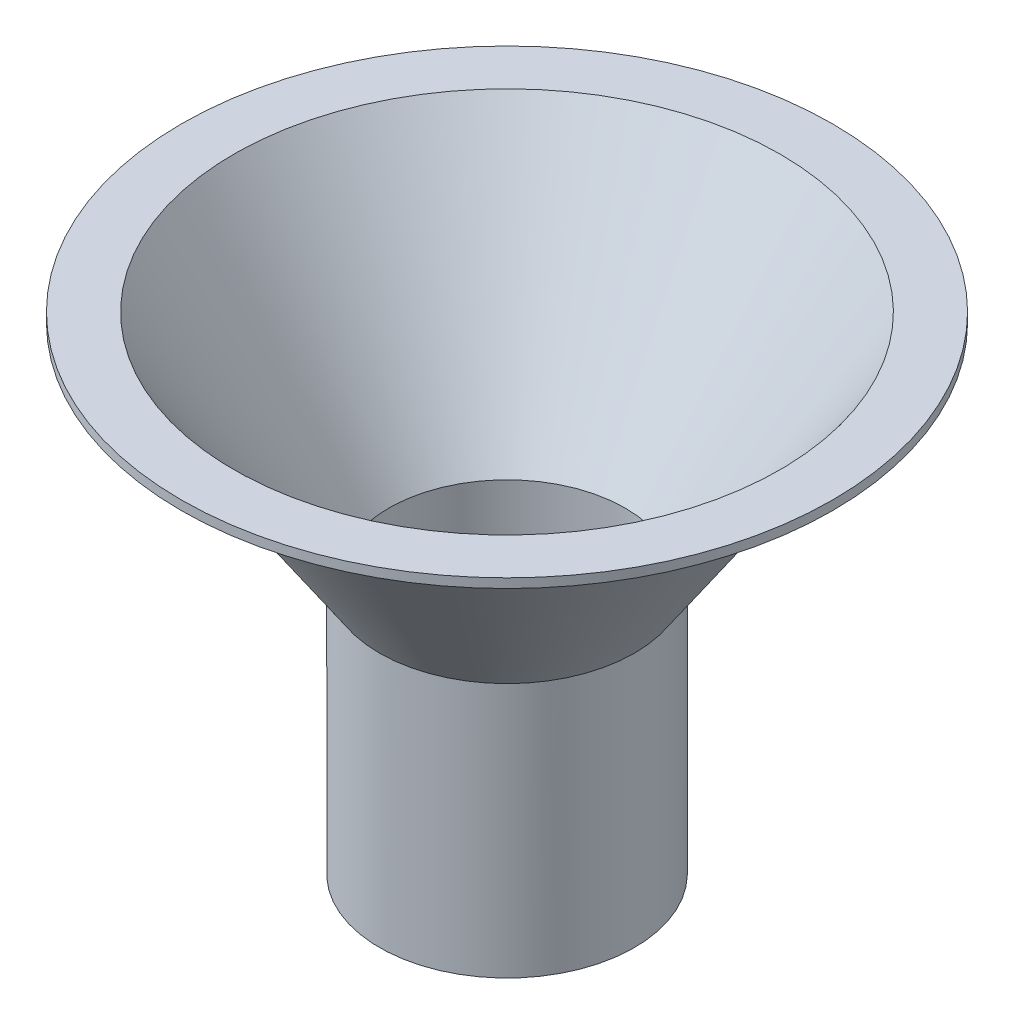
ISO-10303-21;
HEADER;
FILE_DESCRIPTION(('STEP AP214'),'2;1');
FILE_NAME('part.step','',(''),(''),'','','');
FILE_SCHEMA(('AUTOMOTIVE_DESIGN { 1 0 10303 214 1 1 1 1 }'));
ENDSEC;
DATA;
#1=APPLICATION_CONTEXT('core data for automotive mechanical design processes');
#2=APPLICATION_PROTOCOL_DEFINITION('international standard','automotive_design',2000,#1);
#3=PRODUCT_CONTEXT('',#1,'mechanical');
#4=PRODUCT('Part','Part','',(#3));
#5=PRODUCT_RELATED_PRODUCT_CATEGORY('part','',(#4));
#6=PRODUCT_DEFINITION_FORMATION('','',#4);
#7=PRODUCT_DEFINITION_CONTEXT('part definition',#1,'design');
#8=PRODUCT_DEFINITION('design','',#6,#7);
#9=PRODUCT_DEFINITION_SHAPE('','',#8);
#10=(LENGTH_UNIT() NAMED_UNIT(*) SI_UNIT(.MILLI.,.METRE.));
#11=(NAMED_UNIT(*) PLANE_ANGLE_UNIT() SI_UNIT($,.RADIAN.));
#12=(NAMED_UNIT(*) SI_UNIT($,.STERADIAN.) SOLID_ANGLE_UNIT());
#13=UNCERTAINTY_MEASURE_WITH_UNIT(LENGTH_MEASURE(1.E-05),#10,'distance_accuracy_value','');
#14=(GEOMETRIC_REPRESENTATION_CONTEXT(3) GLOBAL_UNCERTAINTY_ASSIGNED_CONTEXT((#13)) GLOBAL_UNIT_ASSIGNED_CONTEXT((#10,
#11,#12)) REPRESENTATION_CONTEXT('',''));
#15=CARTESIAN_POINT('',(0.,0.,0.));
#16=DIRECTION('',(0.,0.,1.));
#17=DIRECTION('',(1.,0.,0.));
#18=AXIS2_PLACEMENT_3D('',#15,#16,#17);
#19=CARTESIAN_POINT('',(-29.,-2.,0.));
#20=DIRECTION('',(0.,-1.,0.));
#21=DIRECTION('',(0.,0.,-1.));
#22=AXIS2_PLACEMENT_3D('',#19,#20,#21);
#23=PLANE('',#22);
#24=CARTESIAN_POINT('',(0.,-2.,0.));
#25=DIRECTION('',(0.,-1.,0.));
#26=DIRECTION('',(0.,0.,-1.));
#27=AXIS2_PLACEMENT_3D('',#24,#25,#26);
#28=CIRCLE('',#27,23.5755389433413);
#29=CARTESIAN_POINT('',(0.,-2.,-23.5755389433413));
#30=VERTEX_POINT('',#29);
#31=EDGE_CURVE('E47',#30,#30,#28,.T.);
#32=ORIENTED_EDGE('',*,*,#31,.T.);
#33=EDGE_LOOP('',(#32));
#34=FACE_BOUND('',#33,.T.);
#35=CARTESIAN_POINT('',(0.,-2.,0.));
#36=DIRECTION('',(0.,1.,0.));
#37=DIRECTION('',(0.,0.,1.));
#38=AXIS2_PLACEMENT_3D('',#35,#36,#37);
#39=CIRCLE('',#38,28.1);
#40=CARTESIAN_POINT('',(0.,-2.,28.1));
#41=VERTEX_POINT('',#40);
#42=EDGE_CURVE('E58',#41,#41,#39,.T.);
#43=ORIENTED_EDGE('',*,*,#42,.T.);
#44=EDGE_LOOP('',(#43));
#45=FACE_BOUND('',#44,.T.);
#46=ADVANCED_FACE('F32',(#34,#45),#23,.F.);
#47=CARTESIAN_POINT('',(-29.,-2.8,0.));
#48=DIRECTION('',(0.,1.,0.));
#49=DIRECTION('',(0.,0.,1.));
#50=AXIS2_PLACEMENT_3D('',#47,#48,#49);
#51=PLANE('',#50);
#52=CARTESIAN_POINT('',(0.,-2.8,0.));
#53=DIRECTION('',(0.,1.,0.));
#54=DIRECTION('',(0.,0.,1.));
#55=AXIS2_PLACEMENT_3D('',#52,#53,#54);
#56=CIRCLE('',#55,28.);
#57=CARTESIAN_POINT('',(0.,-2.8,28.));
#58=VERTEX_POINT('',#57);
#59=EDGE_CURVE('E61',#58,#58,#56,.T.);
#60=ORIENTED_EDGE('',*,*,#59,.T.);
#61=EDGE_LOOP('',(#60));
#62=FACE_BOUND('',#61,.T.);
#63=CARTESIAN_POINT('',(0.,-2.8,0.));
#64=DIRECTION('',(0.,1.,0.));
#65=DIRECTION('',(0.,0.,1.));
#66=AXIS2_PLACEMENT_3D('',#63,#64,#65);
#67=CIRCLE('',#66,28.1);
#68=CARTESIAN_POINT('',(0.,-2.8,28.1));
#69=VERTEX_POINT('',#68);
#70=EDGE_CURVE('E55',#69,#69,#67,.T.);
#71=ORIENTED_EDGE('',*,*,#70,.F.);
#72=EDGE_LOOP('',(#71));
#73=FACE_BOUND('',#72,.T.);
#74=ADVANCED_FACE('F90',(#62,#73),#51,.F.);
#75=CARTESIAN_POINT('',(0.,0.,0.));
#76=DIRECTION('',(0.,-1.,0.));
#77=DIRECTION('',(0.,0.,-1.));
#78=AXIS2_PLACEMENT_3D('',#75,#76,#77);
#79=CYLINDRICAL_SURFACE('',#78,11.);
#80=CARTESIAN_POINT('',(0.,-44.,0.));
#81=DIRECTION('',(0.,-1.,0.));
#82=DIRECTION('',(0.,0.,-1.));
#83=AXIS2_PLACEMENT_3D('',#80,#81,#82);
#84=CIRCLE('',#83,11.);
#85=CARTESIAN_POINT('',(0.,-44.,-11.));
#86=VERTEX_POINT('',#85);
#87=EDGE_CURVE('E10',#86,#86,#84,.T.);
#88=ORIENTED_EDGE('',*,*,#87,.F.);
#89=EDGE_LOOP('',(#88));
#90=FACE_BOUND('',#89,.T.);
#91=CARTESIAN_POINT('',(0.,-22.,0.));
#92=DIRECTION('',(0.,-1.,0.));
#93=DIRECTION('',(0.,0.,-1.));
#94=AXIS2_PLACEMENT_3D('',#91,#92,#93);
#95=CIRCLE('',#94,11.);
#96=CARTESIAN_POINT('',(0.,-22.,-11.));
#97=VERTEX_POINT('',#96);
#98=EDGE_CURVE('E52',#97,#97,#95,.T.);
#99=ORIENTED_EDGE('',*,*,#98,.T.);
#100=EDGE_LOOP('',(#99));
#101=FACE_BOUND('',#100,.T.);
#102=ADVANCED_FACE('F34',(#90,#101),#79,.T.);
#103=CARTESIAN_POINT('',(-11.,-44.,0.));
#104=DIRECTION('',(0.,1.,0.));
#105=DIRECTION('',(0.,0.,1.));
#106=AXIS2_PLACEMENT_3D('',#103,#104,#105);
#107=PLANE('',#106);
#108=CARTESIAN_POINT('',(0.,-44.,0.));
#109=DIRECTION('',(0.,-1.,0.));
#110=DIRECTION('',(0.,0.,-1.));
#111=AXIS2_PLACEMENT_3D('',#108,#109,#110);
#112=CIRCLE('',#111,10.2);
#113=CARTESIAN_POINT('',(0.,-44.,-10.2));
#114=VERTEX_POINT('',#113);
#115=EDGE_CURVE('E39',#114,#114,#112,.T.);
#116=ORIENTED_EDGE('',*,*,#115,.F.);
#117=EDGE_LOOP('',(#116));
#118=FACE_BOUND('',#117,.T.);
#119=ORIENTED_EDGE('',*,*,#87,.T.);
#120=EDGE_LOOP('',(#119));
#121=FACE_BOUND('',#120,.T.);
#122=ADVANCED_FACE('F100',(#118,#121),#107,.F.);
#123=CARTESIAN_POINT('',(0.,0.,0.));
#124=DIRECTION('',(0.,-1.,0.));
#125=DIRECTION('',(0.,0.,-1.));
#126=AXIS2_PLACEMENT_3D('',#123,#124,#125);
#127=CYLINDRICAL_SURFACE('',#126,10.2);
#128=CARTESIAN_POINT('',(0.,-21.7546421317041,0.));
#129=DIRECTION('',(0.,-1.,0.));
#130=DIRECTION('',(0.,0.,-1.));
#131=AXIS2_PLACEMENT_3D('',#128,#129,#130);
#132=CIRCLE('',#131,10.2);
#133=CARTESIAN_POINT('',(0.,-21.7546421317041,-10.2));
#134=VERTEX_POINT('',#133);
#135=EDGE_CURVE('E43',#134,#134,#132,.T.);
#136=ORIENTED_EDGE('',*,*,#135,.F.);
#137=EDGE_LOOP('',(#136));
#138=FACE_BOUND('',#137,.T.);
#139=ORIENTED_EDGE('',*,*,#115,.T.);
#140=EDGE_LOOP('',(#139));
#141=FACE_BOUND('',#140,.T.);
#142=ADVANCED_FACE('F84',(#138,#141),#127,.F.);
#143=CARTESIAN_POINT('',(0.,-21.7546421317041,0.));
#144=DIRECTION('',(0.,1.,0.));
#145=DIRECTION('',(0.,0.,1.));
#146=AXIS2_PLACEMENT_3D('',#143,#144,#145);
#147=CONICAL_SURFACE('',#146,10.2,0.595179513814989);
#148=ORIENTED_EDGE('',*,*,#31,.F.);
#149=EDGE_LOOP('',(#148));
#150=FACE_BOUND('',#149,.T.);
#151=ORIENTED_EDGE('',*,*,#135,.T.);
#152=EDGE_LOOP('',(#151));
#153=FACE_BOUND('',#152,.T.);
#154=ADVANCED_FACE('F74',(#150,#153),#147,.F.);
#155=CARTESIAN_POINT('',(0.,-6.8,0.));
#156=DIRECTION('',(0.,1.,0.));
#157=DIRECTION('',(0.,0.,1.));
#158=AXIS2_PLACEMENT_3D('',#155,#156,#157);
#159=CONICAL_SURFACE('',#158,21.2916666666667,0.595179513814989);
#160=ORIENTED_EDGE('',*,*,#98,.F.);
#161=EDGE_LOOP('',(#160));
#162=FACE_BOUND('',#161,.T.);
#163=CARTESIAN_POINT('',(0.,-6.8,0.));
#164=DIRECTION('',(0.,1.,0.));
#165=DIRECTION('',(0.,0.,1.));
#166=AXIS2_PLACEMENT_3D('',#163,#164,#165);
#167=CIRCLE('',#166,21.2916666666667);
#168=CARTESIAN_POINT('',(0.,-6.8,21.2916666666667));
#169=VERTEX_POINT('',#168);
#170=EDGE_CURVE('E64',#169,#169,#167,.T.);
#171=ORIENTED_EDGE('',*,*,#170,.F.);
#172=EDGE_LOOP('',(#171));
#173=FACE_BOUND('',#172,.T.);
#174=ADVANCED_FACE('F71',(#162,#173),#159,.T.);
#175=CARTESIAN_POINT('',(0.,0.,0.));
#176=DIRECTION('',(0.,1.,0.));
#177=DIRECTION('',(0.,0.,1.));
#178=AXIS2_PLACEMENT_3D('',#175,#176,#177);
#179=CYLINDRICAL_SURFACE('',#178,28.1);
#180=ORIENTED_EDGE('',*,*,#42,.F.);
#181=EDGE_LOOP('',(#180));
#182=FACE_BOUND('',#181,.T.);
#183=ORIENTED_EDGE('',*,*,#70,.T.);
#184=EDGE_LOOP('',(#183));
#185=FACE_BOUND('',#184,.T.);
#186=ADVANCED_FACE('F73',(#182,#185),#179,.T.);
#187=CARTESIAN_POINT('',(0.,-2.8,0.));
#188=DIRECTION('',(0.,1.,0.));
#189=DIRECTION('',(0.,0.,1.));
#190=AXIS2_PLACEMENT_3D('',#187,#188,#189);
#191=CONICAL_SURFACE('',#190,28.,1.03312155888153);
#192=ORIENTED_EDGE('',*,*,#170,.T.);
#193=EDGE_LOOP('',(#192));
#194=FACE_BOUND('',#193,.T.);
#195=ORIENTED_EDGE('',*,*,#59,.F.);
#196=EDGE_LOOP('',(#195));
#197=FACE_BOUND('',#196,.T.);
#198=ADVANCED_FACE('F68',(#194,#197),#191,.T.);
#199=CLOSED_SHELL('',(#46,#74,#102,#122,#142,#154,#174,#186,#198));
#200=MANIFOLD_SOLID_BREP('B2',#199);
#201=ADVANCED_BREP_SHAPE_REPRESENTATION('',(#18,#200),#14);
#202=SHAPE_DEFINITION_REPRESENTATION(#9,#201);
ENDSEC;
END-ISO-10303-21;
